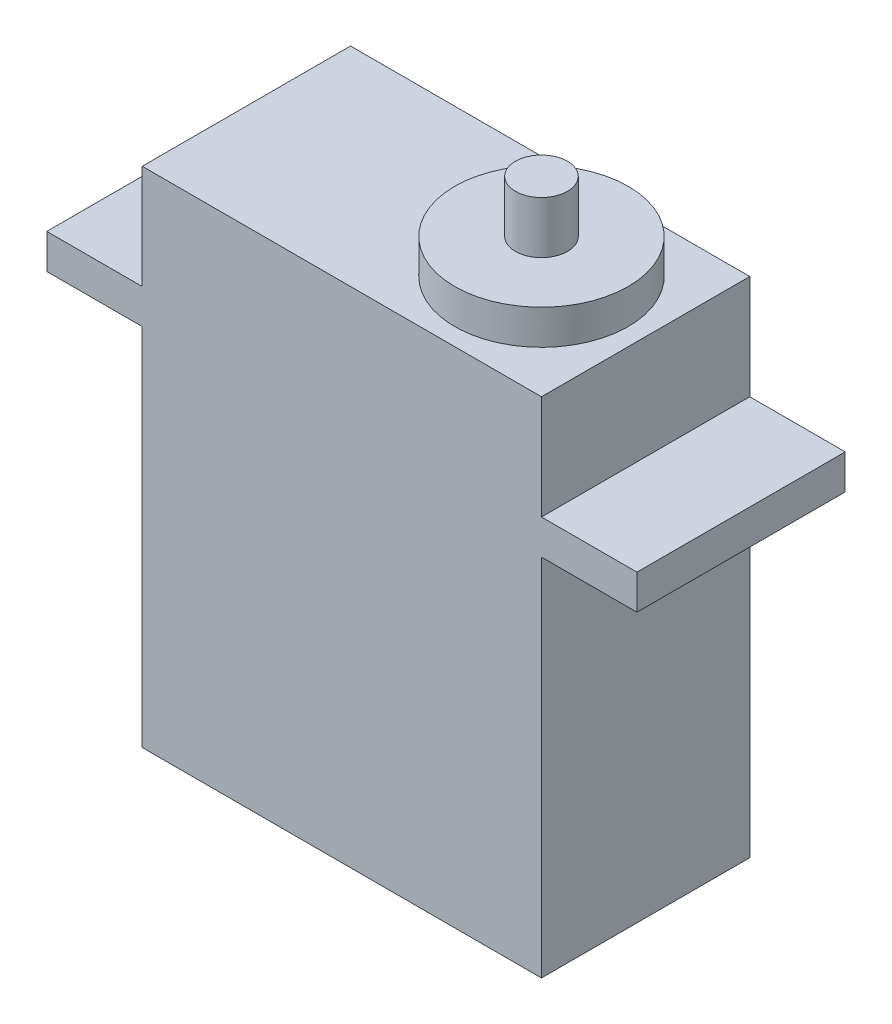
ISO-10303-21;
HEADER;
FILE_DESCRIPTION(('STEP AP214'),'2;1');
FILE_NAME('part.step','',(''),(''),'','','');
FILE_SCHEMA(('AUTOMOTIVE_DESIGN { 1 0 10303 214 1 1 1 1 }'));
ENDSEC;
DATA;
#1=APPLICATION_CONTEXT('core data for automotive mechanical design processes');
#2=APPLICATION_PROTOCOL_DEFINITION('international standard','automotive_design',2000,#1);
#3=PRODUCT_CONTEXT('',#1,'mechanical');
#4=PRODUCT('Part','Part','',(#3));
#5=PRODUCT_RELATED_PRODUCT_CATEGORY('part','',(#4));
#6=PRODUCT_DEFINITION_FORMATION('','',#4);
#7=PRODUCT_DEFINITION_CONTEXT('part definition',#1,'design');
#8=PRODUCT_DEFINITION('design','',#6,#7);
#9=PRODUCT_DEFINITION_SHAPE('','',#8);
#10=(LENGTH_UNIT() NAMED_UNIT(*) SI_UNIT(.MILLI.,.METRE.));
#11=(NAMED_UNIT(*) PLANE_ANGLE_UNIT() SI_UNIT($,.RADIAN.));
#12=(NAMED_UNIT(*) SI_UNIT($,.STERADIAN.) SOLID_ANGLE_UNIT());
#13=UNCERTAINTY_MEASURE_WITH_UNIT(LENGTH_MEASURE(1.E-05),#10,'distance_accuracy_value','');
#14=(GEOMETRIC_REPRESENTATION_CONTEXT(3) GLOBAL_UNCERTAINTY_ASSIGNED_CONTEXT((#13)) GLOBAL_UNIT_ASSIGNED_CONTEXT((#10,
#11,#12)) REPRESENTATION_CONTEXT('',''));
#15=CARTESIAN_POINT('',(0.,0.,0.));
#16=DIRECTION('',(0.,0.,1.));
#17=DIRECTION('',(1.,0.,0.));
#18=AXIS2_PLACEMENT_3D('',#15,#16,#17);
#19=CARTESIAN_POINT('',(0.,0.,12.));
#20=DIRECTION('',(1.,0.,0.));
#21=DIRECTION('',(0.,0.,-1.));
#22=AXIS2_PLACEMENT_3D('',#19,#20,#21);
#23=PLANE('',#22);
#24=DIRECTION('',(0.,-1.,0.));
#25=VECTOR('',#24,1.);
#26=CARTESIAN_POINT('',(0.,0.,0.));
#27=LINE('',#26,#25);
#28=CARTESIAN_POINT('',(0.,29.,0.));
#29=VERTEX_POINT('',#28);
#30=CARTESIAN_POINT('',(0.,23.,0.));
#31=VERTEX_POINT('',#30);
#32=EDGE_CURVE('E193',#29,#31,#27,.T.);
#33=ORIENTED_EDGE('',*,*,#32,.T.);
#34=DIRECTION('',(0.,0.,1.));
#35=VECTOR('',#34,1.);
#36=CARTESIAN_POINT('',(0.,23.,12.));
#37=LINE('',#36,#35);
#38=CARTESIAN_POINT('',(0.,23.,12.));
#39=VERTEX_POINT('',#38);
#40=EDGE_CURVE('E177',#31,#39,#37,.T.);
#41=ORIENTED_EDGE('',*,*,#40,.T.);
#42=DIRECTION('',(0.,-1.,0.));
#43=VECTOR('',#42,1.);
#44=CARTESIAN_POINT('',(0.,0.,12.));
#45=LINE('',#44,#43);
#46=CARTESIAN_POINT('',(0.,29.,12.));
#47=VERTEX_POINT('',#46);
#48=EDGE_CURVE('E180',#47,#39,#45,.T.);
#49=ORIENTED_EDGE('',*,*,#48,.F.);
#50=DIRECTION('',(0.,0.,-1.));
#51=VECTOR('',#50,1.);
#52=CARTESIAN_POINT('',(0.,29.,12.));
#53=LINE('',#52,#51);
#54=EDGE_CURVE('E192',#47,#29,#53,.T.);
#55=ORIENTED_EDGE('',*,*,#54,.T.);
#56=EDGE_LOOP('',(#33,#41,#49,#55));
#57=FACE_BOUND('',#56,.T.);
#58=ADVANCED_FACE('F33',(#57),#23,.F.);
#59=CARTESIAN_POINT('',(23.,0.,12.));
#60=DIRECTION('',(-1.,0.,0.));
#61=DIRECTION('',(0.,0.,1.));
#62=AXIS2_PLACEMENT_3D('',#59,#60,#61);
#63=PLANE('',#62);
#64=DIRECTION('',(0.,1.,0.));
#65=VECTOR('',#64,1.);
#66=CARTESIAN_POINT('',(23.,0.,12.));
#67=LINE('',#66,#65);
#68=CARTESIAN_POINT('',(23.,23.,12.));
#69=VERTEX_POINT('',#68);
#70=CARTESIAN_POINT('',(23.,29.,12.));
#71=VERTEX_POINT('',#70);
#72=EDGE_CURVE('E186',#69,#71,#67,.T.);
#73=ORIENTED_EDGE('',*,*,#72,.F.);
#74=DIRECTION('',(0.,0.,-1.));
#75=VECTOR('',#74,1.);
#76=CARTESIAN_POINT('',(23.,23.,12.));
#77=LINE('',#76,#75);
#78=CARTESIAN_POINT('',(23.,23.,0.));
#79=VERTEX_POINT('',#78);
#80=EDGE_CURVE('E174',#69,#79,#77,.T.);
#81=ORIENTED_EDGE('',*,*,#80,.T.);
#82=DIRECTION('',(0.,1.,0.));
#83=VECTOR('',#82,1.);
#84=CARTESIAN_POINT('',(23.,0.,0.));
#85=LINE('',#84,#83);
#86=CARTESIAN_POINT('',(23.,29.,0.));
#87=VERTEX_POINT('',#86);
#88=EDGE_CURVE('E198',#79,#87,#85,.T.);
#89=ORIENTED_EDGE('',*,*,#88,.T.);
#90=DIRECTION('',(0.,0.,-1.));
#91=VECTOR('',#90,1.);
#92=CARTESIAN_POINT('',(23.,29.,12.));
#93=LINE('',#92,#91);
#94=EDGE_CURVE('E206',#71,#87,#93,.T.);
#95=ORIENTED_EDGE('',*,*,#94,.F.);
#96=EDGE_LOOP('',(#73,#81,#89,#95));
#97=FACE_BOUND('',#96,.T.);
#98=ADVANCED_FACE('F239',(#97),#63,.F.);
#99=CARTESIAN_POINT('',(0.,21.,12.));
#100=VERTEX_POINT('',#99);
#101=CARTESIAN_POINT('',(0.,0.,12.));
#102=VERTEX_POINT('',#101);
#103=EDGE_CURVE('E184',#100,#102,#45,.T.);
#104=ORIENTED_EDGE('',*,*,#103,.F.);
#105=DIRECTION('',(0.,0.,-1.));
#106=VECTOR('',#105,1.);
#107=CARTESIAN_POINT('',(0.,21.,12.));
#108=LINE('',#107,#106);
#109=CARTESIAN_POINT('',(0.,21.,0.));
#110=VERTEX_POINT('',#109);
#111=EDGE_CURVE('E172',#100,#110,#108,.T.);
#112=ORIENTED_EDGE('',*,*,#111,.T.);
#113=CARTESIAN_POINT('',(0.,0.,0.));
#114=VERTEX_POINT('',#113);
#115=EDGE_CURVE('E139',#110,#114,#27,.T.);
#116=ORIENTED_EDGE('',*,*,#115,.T.);
#117=DIRECTION('',(0.,0.,-1.));
#118=VECTOR('',#117,1.);
#119=CARTESIAN_POINT('',(0.,0.,12.));
#120=LINE('',#119,#118);
#121=EDGE_CURVE('E41',#102,#114,#120,.T.);
#122=ORIENTED_EDGE('',*,*,#121,.F.);
#123=EDGE_LOOP('',(#104,#112,#116,#122));
#124=FACE_BOUND('',#123,.T.);
#125=ADVANCED_FACE('F35',(#124),#23,.F.);
#126=CARTESIAN_POINT('',(0.,0.,12.));
#127=DIRECTION('',(0.,1.,0.));
#128=DIRECTION('',(0.,0.,1.));
#129=AXIS2_PLACEMENT_3D('',#126,#127,#128);
#130=PLANE('',#129);
#131=DIRECTION('',(1.,0.,0.));
#132=VECTOR('',#131,1.);
#133=CARTESIAN_POINT('',(0.,0.,0.));
#134=LINE('',#133,#132);
#135=CARTESIAN_POINT('',(23.,0.,0.));
#136=VERTEX_POINT('',#135);
#137=EDGE_CURVE('E196',#114,#136,#134,.T.);
#138=ORIENTED_EDGE('',*,*,#137,.T.);
#139=DIRECTION('',(0.,0.,-1.));
#140=VECTOR('',#139,1.);
#141=CARTESIAN_POINT('',(23.,0.,12.));
#142=LINE('',#141,#140);
#143=CARTESIAN_POINT('',(23.,0.,12.));
#144=VERTEX_POINT('',#143);
#145=EDGE_CURVE('E209',#144,#136,#142,.T.);
#146=ORIENTED_EDGE('',*,*,#145,.F.);
#147=DIRECTION('',(1.,0.,0.));
#148=VECTOR('',#147,1.);
#149=CARTESIAN_POINT('',(0.,0.,12.));
#150=LINE('',#149,#148);
#151=EDGE_CURVE('E183',#102,#144,#150,.T.);
#152=ORIENTED_EDGE('',*,*,#151,.F.);
#153=ORIENTED_EDGE('',*,*,#121,.T.);
#154=EDGE_LOOP('',(#138,#146,#152,#153));
#155=FACE_BOUND('',#154,.T.);
#156=ADVANCED_FACE('F215',(#155),#130,.F.);
#157=CARTESIAN_POINT('',(23.,21.,0.));
#158=VERTEX_POINT('',#157);
#159=EDGE_CURVE('E199',#136,#158,#85,.T.);
#160=ORIENTED_EDGE('',*,*,#159,.T.);
#161=DIRECTION('',(0.,0.,1.));
#162=VECTOR('',#161,1.);
#163=CARTESIAN_POINT('',(23.,21.,12.));
#164=LINE('',#163,#162);
#165=CARTESIAN_POINT('',(23.,21.,12.));
#166=VERTEX_POINT('',#165);
#167=EDGE_CURVE('E165',#158,#166,#164,.T.);
#168=ORIENTED_EDGE('',*,*,#167,.T.);
#169=EDGE_CURVE('E187',#144,#166,#67,.T.);
#170=ORIENTED_EDGE('',*,*,#169,.F.);
#171=ORIENTED_EDGE('',*,*,#145,.T.);
#172=EDGE_LOOP('',(#160,#168,#170,#171));
#173=FACE_BOUND('',#172,.T.);
#174=ADVANCED_FACE('F223',(#173),#63,.F.);
#175=CARTESIAN_POINT('',(0.,29.,12.));
#176=DIRECTION('',(0.,-1.,0.));
#177=DIRECTION('',(0.,0.,-1.));
#178=AXIS2_PLACEMENT_3D('',#175,#176,#177);
#179=PLANE('',#178);
#180=CARTESIAN_POINT('',(17.,29.,6.));
#181=DIRECTION('',(0.,-1.,0.));
#182=DIRECTION('',(0.,0.,-1.));
#183=AXIS2_PLACEMENT_3D('',#180,#181,#182);
#184=CIRCLE('',#183,5.);
#185=CARTESIAN_POINT('',(17.,29.,0.999999999999999));
#186=VERTEX_POINT('',#185);
#187=EDGE_CURVE('E11',#186,#186,#184,.F.);
#188=ORIENTED_EDGE('',*,*,#187,.F.);
#189=EDGE_LOOP('',(#188));
#190=FACE_BOUND('',#189,.T.);
#191=DIRECTION('',(-1.,0.,0.));
#192=VECTOR('',#191,1.);
#193=CARTESIAN_POINT('',(0.,29.,0.));
#194=LINE('',#193,#192);
#195=EDGE_CURVE('E202',#87,#29,#194,.T.);
#196=ORIENTED_EDGE('',*,*,#195,.T.);
#197=ORIENTED_EDGE('',*,*,#54,.F.);
#198=DIRECTION('',(-1.,0.,0.));
#199=VECTOR('',#198,1.);
#200=CARTESIAN_POINT('',(0.,29.,12.));
#201=LINE('',#200,#199);
#202=EDGE_CURVE('E190',#71,#47,#201,.T.);
#203=ORIENTED_EDGE('',*,*,#202,.F.);
#204=ORIENTED_EDGE('',*,*,#94,.T.);
#205=EDGE_LOOP('',(#196,#197,#203,#204));
#206=FACE_BOUND('',#205,.T.);
#207=ADVANCED_FACE('F244',(#190,#206),#179,.F.);
#208=CARTESIAN_POINT('',(0.,0.,12.));
#209=DIRECTION('',(0.,0.,-1.));
#210=DIRECTION('',(-1.,0.,0.));
#211=AXIS2_PLACEMENT_3D('',#208,#209,#210);
#212=PLANE('',#211);
#213=ORIENTED_EDGE('',*,*,#169,.T.);
#214=DIRECTION('',(1.,0.,0.));
#215=VECTOR('',#214,1.);
#216=CARTESIAN_POINT('',(-5.5,21.,12.));
#217=LINE('',#216,#215);
#218=CARTESIAN_POINT('',(28.5,21.,12.));
#219=VERTEX_POINT('',#218);
#220=EDGE_CURVE('E160',#166,#219,#217,.T.);
#221=ORIENTED_EDGE('',*,*,#220,.T.);
#222=DIRECTION('',(0.,1.,0.));
#223=VECTOR('',#222,1.);
#224=CARTESIAN_POINT('',(28.5,21.,12.));
#225=LINE('',#224,#223);
#226=CARTESIAN_POINT('',(28.5,23.,12.));
#227=VERTEX_POINT('',#226);
#228=EDGE_CURVE('E162',#219,#227,#225,.T.);
#229=ORIENTED_EDGE('',*,*,#228,.T.);
#230=DIRECTION('',(-1.,0.,0.));
#231=VECTOR('',#230,1.);
#232=CARTESIAN_POINT('',(-5.5,23.,12.));
#233=LINE('',#232,#231);
#234=EDGE_CURVE('E48',#227,#69,#233,.T.);
#235=ORIENTED_EDGE('',*,*,#234,.T.);
#236=ORIENTED_EDGE('',*,*,#72,.T.);
#237=ORIENTED_EDGE('',*,*,#202,.T.);
#238=ORIENTED_EDGE('',*,*,#48,.T.);
#239=CARTESIAN_POINT('',(-5.5,23.,12.));
#240=VERTEX_POINT('',#239);
#241=EDGE_CURVE('E148',#39,#240,#233,.T.);
#242=ORIENTED_EDGE('',*,*,#241,.T.);
#243=DIRECTION('',(0.,-1.,0.));
#244=VECTOR('',#243,1.);
#245=CARTESIAN_POINT('',(-5.5,21.,12.));
#246=LINE('',#245,#244);
#247=CARTESIAN_POINT('',(-5.5,21.,12.));
#248=VERTEX_POINT('',#247);
#249=EDGE_CURVE('E158',#240,#248,#246,.T.);
#250=ORIENTED_EDGE('',*,*,#249,.T.);
#251=EDGE_CURVE('E55',#248,#100,#217,.T.);
#252=ORIENTED_EDGE('',*,*,#251,.T.);
#253=ORIENTED_EDGE('',*,*,#103,.T.);
#254=ORIENTED_EDGE('',*,*,#151,.T.);
#255=EDGE_LOOP('',(#213,#221,#229,#235,#236,#237,#238,#242,#250,#252,#253,#254));
#256=FACE_BOUND('',#255,.T.);
#257=ADVANCED_FACE('F225',(#256),#212,.F.);
#258=CARTESIAN_POINT('',(0.,0.,0.));
#259=DIRECTION('',(0.,0.,-1.));
#260=DIRECTION('',(-1.,0.,0.));
#261=AXIS2_PLACEMENT_3D('',#258,#259,#260);
#262=PLANE('',#261);
#263=ORIENTED_EDGE('',*,*,#115,.F.);
#264=DIRECTION('',(1.,0.,0.));
#265=VECTOR('',#264,1.);
#266=CARTESIAN_POINT('',(-5.5,21.,0.));
#267=LINE('',#266,#265);
#268=CARTESIAN_POINT('',(-5.5,21.,0.));
#269=VERTEX_POINT('',#268);
#270=EDGE_CURVE('E124',#269,#110,#267,.T.);
#271=ORIENTED_EDGE('',*,*,#270,.F.);
#272=DIRECTION('',(0.,-1.,0.));
#273=VECTOR('',#272,1.);
#274=CARTESIAN_POINT('',(-5.5,21.,0.));
#275=LINE('',#274,#273);
#276=CARTESIAN_POINT('',(-5.5,23.,0.));
#277=VERTEX_POINT('',#276);
#278=EDGE_CURVE('E137',#277,#269,#275,.T.);
#279=ORIENTED_EDGE('',*,*,#278,.F.);
#280=DIRECTION('',(-1.,0.,0.));
#281=VECTOR('',#280,1.);
#282=CARTESIAN_POINT('',(-5.5,23.,0.));
#283=LINE('',#282,#281);
#284=EDGE_CURVE('E156',#31,#277,#283,.T.);
#285=ORIENTED_EDGE('',*,*,#284,.F.);
#286=ORIENTED_EDGE('',*,*,#32,.F.);
#287=ORIENTED_EDGE('',*,*,#195,.F.);
#288=ORIENTED_EDGE('',*,*,#88,.F.);
#289=CARTESIAN_POINT('',(28.5,23.,0.));
#290=VERTEX_POINT('',#289);
#291=EDGE_CURVE('E130',#290,#79,#283,.T.);
#292=ORIENTED_EDGE('',*,*,#291,.F.);
#293=DIRECTION('',(0.,1.,0.));
#294=VECTOR('',#293,1.);
#295=CARTESIAN_POINT('',(28.5,21.,0.));
#296=LINE('',#295,#294);
#297=CARTESIAN_POINT('',(28.5,21.,0.));
#298=VERTEX_POINT('',#297);
#299=EDGE_CURVE('E140',#298,#290,#296,.T.);
#300=ORIENTED_EDGE('',*,*,#299,.F.);
#301=EDGE_CURVE('E141',#158,#298,#267,.T.);
#302=ORIENTED_EDGE('',*,*,#301,.F.);
#303=ORIENTED_EDGE('',*,*,#159,.F.);
#304=ORIENTED_EDGE('',*,*,#137,.F.);
#305=EDGE_LOOP('',(#263,#271,#279,#285,#286,#287,#288,#292,#300,#302,#303,#304));
#306=FACE_BOUND('',#305,.T.);
#307=ADVANCED_FACE('F135',(#306),#262,.T.);
#308=CARTESIAN_POINT('',(28.5,21.,0.));
#309=DIRECTION('',(1.,0.,0.));
#310=DIRECTION('',(0.,0.,-1.));
#311=AXIS2_PLACEMENT_3D('',#308,#309,#310);
#312=PLANE('',#311);
#313=ORIENTED_EDGE('',*,*,#228,.F.);
#314=DIRECTION('',(0.,0.,1.));
#315=VECTOR('',#314,1.);
#316=CARTESIAN_POINT('',(28.5,21.,0.));
#317=LINE('',#316,#315);
#318=EDGE_CURVE('E129',#298,#219,#317,.T.);
#319=ORIENTED_EDGE('',*,*,#318,.F.);
#320=ORIENTED_EDGE('',*,*,#299,.T.);
#321=DIRECTION('',(0.,0.,1.));
#322=VECTOR('',#321,1.);
#323=CARTESIAN_POINT('',(28.5,23.,0.));
#324=LINE('',#323,#322);
#325=EDGE_CURVE('E166',#290,#227,#324,.T.);
#326=ORIENTED_EDGE('',*,*,#325,.T.);
#327=EDGE_LOOP('',(#313,#319,#320,#326));
#328=FACE_BOUND('',#327,.T.);
#329=ADVANCED_FACE('F231',(#328),#312,.T.);
#330=CARTESIAN_POINT('',(-5.5,21.,0.));
#331=DIRECTION('',(0.,-1.,0.));
#332=DIRECTION('',(0.,0.,-1.));
#333=AXIS2_PLACEMENT_3D('',#330,#331,#332);
#334=PLANE('',#333);
#335=ORIENTED_EDGE('',*,*,#167,.F.);
#336=ORIENTED_EDGE('',*,*,#301,.T.);
#337=ORIENTED_EDGE('',*,*,#318,.T.);
#338=ORIENTED_EDGE('',*,*,#220,.F.);
#339=EDGE_LOOP('',(#335,#336,#337,#338));
#340=FACE_BOUND('',#339,.T.);
#341=ADVANCED_FACE('F229',(#340),#334,.T.);
#342=CARTESIAN_POINT('',(-5.5,23.,0.));
#343=DIRECTION('',(0.,1.,0.));
#344=DIRECTION('',(0.,0.,1.));
#345=AXIS2_PLACEMENT_3D('',#342,#343,#344);
#346=PLANE('',#345);
#347=ORIENTED_EDGE('',*,*,#80,.F.);
#348=ORIENTED_EDGE('',*,*,#234,.F.);
#349=ORIENTED_EDGE('',*,*,#325,.F.);
#350=ORIENTED_EDGE('',*,*,#291,.T.);
#351=EDGE_LOOP('',(#347,#348,#349,#350));
#352=FACE_BOUND('',#351,.T.);
#353=ADVANCED_FACE('F234',(#352),#346,.T.);
#354=ORIENTED_EDGE('',*,*,#40,.F.);
#355=ORIENTED_EDGE('',*,*,#284,.T.);
#356=DIRECTION('',(0.,0.,1.));
#357=VECTOR('',#356,1.);
#358=CARTESIAN_POINT('',(-5.5,23.,0.));
#359=LINE('',#358,#357);
#360=EDGE_CURVE('E146',#277,#240,#359,.T.);
#361=ORIENTED_EDGE('',*,*,#360,.T.);
#362=ORIENTED_EDGE('',*,*,#241,.F.);
#363=EDGE_LOOP('',(#354,#355,#361,#362));
#364=FACE_BOUND('',#363,.T.);
#365=ADVANCED_FACE('F249',(#364),#346,.T.);
#366=ORIENTED_EDGE('',*,*,#111,.F.);
#367=ORIENTED_EDGE('',*,*,#251,.F.);
#368=DIRECTION('',(0.,0.,1.));
#369=VECTOR('',#368,1.);
#370=CARTESIAN_POINT('',(-5.5,21.,0.));
#371=LINE('',#370,#369);
#372=EDGE_CURVE('E121',#269,#248,#371,.T.);
#373=ORIENTED_EDGE('',*,*,#372,.F.);
#374=ORIENTED_EDGE('',*,*,#270,.T.);
#375=EDGE_LOOP('',(#366,#367,#373,#374));
#376=FACE_BOUND('',#375,.T.);
#377=ADVANCED_FACE('F123',(#376),#334,.T.);
#378=CARTESIAN_POINT('',(-5.5,21.,0.));
#379=DIRECTION('',(-1.,0.,0.));
#380=DIRECTION('',(0.,0.,1.));
#381=AXIS2_PLACEMENT_3D('',#378,#379,#380);
#382=PLANE('',#381);
#383=ORIENTED_EDGE('',*,*,#249,.F.);
#384=ORIENTED_EDGE('',*,*,#360,.F.);
#385=ORIENTED_EDGE('',*,*,#278,.T.);
#386=ORIENTED_EDGE('',*,*,#372,.T.);
#387=EDGE_LOOP('',(#383,#384,#385,#386));
#388=FACE_BOUND('',#387,.T.);
#389=ADVANCED_FACE('F144',(#388),#382,.T.);
#390=CARTESIAN_POINT('',(17.,31.,6.));
#391=DIRECTION('',(0.,-1.,0.));
#392=DIRECTION('',(0.,0.,-1.));
#393=AXIS2_PLACEMENT_3D('',#390,#391,#392);
#394=CYLINDRICAL_SURFACE('',#393,5.);
#395=CARTESIAN_POINT('',(17.,31.,6.));
#396=DIRECTION('',(0.,1.,0.));
#397=DIRECTION('',(0.,0.,1.));
#398=AXIS2_PLACEMENT_3D('',#395,#396,#397);
#399=CIRCLE('',#398,5.);
#400=CARTESIAN_POINT('',(17.,31.,11.));
#401=VERTEX_POINT('',#400);
#402=EDGE_CURVE('E151',#401,#401,#399,.T.);
#403=ORIENTED_EDGE('',*,*,#402,.F.);
#404=EDGE_LOOP('',(#403));
#405=FACE_BOUND('',#404,.T.);
#406=ORIENTED_EDGE('',*,*,#187,.T.);
#407=EDGE_LOOP('',(#406));
#408=FACE_BOUND('',#407,.T.);
#409=ADVANCED_FACE('F280',(#405,#408),#394,.T.);
#410=CARTESIAN_POINT('',(17.,31.,6.));
#411=DIRECTION('',(0.,1.,0.));
#412=DIRECTION('',(0.,0.,1.));
#413=AXIS2_PLACEMENT_3D('',#410,#411,#412);
#414=PLANE('',#413);
#415=CARTESIAN_POINT('',(17.,31.,6.));
#416=DIRECTION('',(0.,1.,0.));
#417=DIRECTION('',(0.,0.,1.));
#418=AXIS2_PLACEMENT_3D('',#415,#416,#417);
#419=CIRCLE('',#418,1.5);
#420=CARTESIAN_POINT('',(17.,31.,7.5));
#421=VERTEX_POINT('',#420);
#422=EDGE_CURVE('E360',#421,#421,#419,.T.);
#423=ORIENTED_EDGE('',*,*,#422,.F.);
#424=EDGE_LOOP('',(#423));
#425=FACE_BOUND('',#424,.T.);
#426=ORIENTED_EDGE('',*,*,#402,.T.);
#427=EDGE_LOOP('',(#426));
#428=FACE_BOUND('',#427,.T.);
#429=ADVANCED_FACE('F324',(#425,#428),#414,.T.);
#430=CARTESIAN_POINT('',(17.,34.,6.));
#431=DIRECTION('',(0.,-1.,0.));
#432=DIRECTION('',(0.,0.,-1.));
#433=AXIS2_PLACEMENT_3D('',#430,#431,#432);
#434=CYLINDRICAL_SURFACE('',#433,1.5);
#435=CARTESIAN_POINT('',(17.,34.,6.));
#436=DIRECTION('',(0.,1.,0.));
#437=DIRECTION('',(0.,0.,1.));
#438=AXIS2_PLACEMENT_3D('',#435,#436,#437);
#439=CIRCLE('',#438,1.5);
#440=CARTESIAN_POINT('',(17.,34.,7.5));
#441=VERTEX_POINT('',#440);
#442=EDGE_CURVE('E359',#441,#441,#439,.T.);
#443=ORIENTED_EDGE('',*,*,#442,.F.);
#444=EDGE_LOOP('',(#443));
#445=FACE_BOUND('',#444,.T.);
#446=ORIENTED_EDGE('',*,*,#422,.T.);
#447=EDGE_LOOP('',(#446));
#448=FACE_BOUND('',#447,.T.);
#449=ADVANCED_FACE('F333',(#445,#448),#434,.T.);
#450=CARTESIAN_POINT('',(17.,34.,6.));
#451=DIRECTION('',(0.,1.,0.));
#452=DIRECTION('',(0.,0.,1.));
#453=AXIS2_PLACEMENT_3D('',#450,#451,#452);
#454=PLANE('',#453);
#455=ORIENTED_EDGE('',*,*,#442,.T.);
#456=EDGE_LOOP('',(#455));
#457=FACE_BOUND('',#456,.T.);
#458=ADVANCED_FACE('F343',(#457),#454,.T.);
#459=CLOSED_SHELL('',(#58,#98,#125,#156,#174,#207,#257,#307,#329,#341,#353,#365,#377,#389,#409,
#429,#449,#458));
#460=MANIFOLD_SOLID_BREP('B2',#459);
#461=ADVANCED_BREP_SHAPE_REPRESENTATION('',(#18,#460),#14);
#462=SHAPE_DEFINITION_REPRESENTATION(#9,#461);
ENDSEC;
END-ISO-10303-21;
